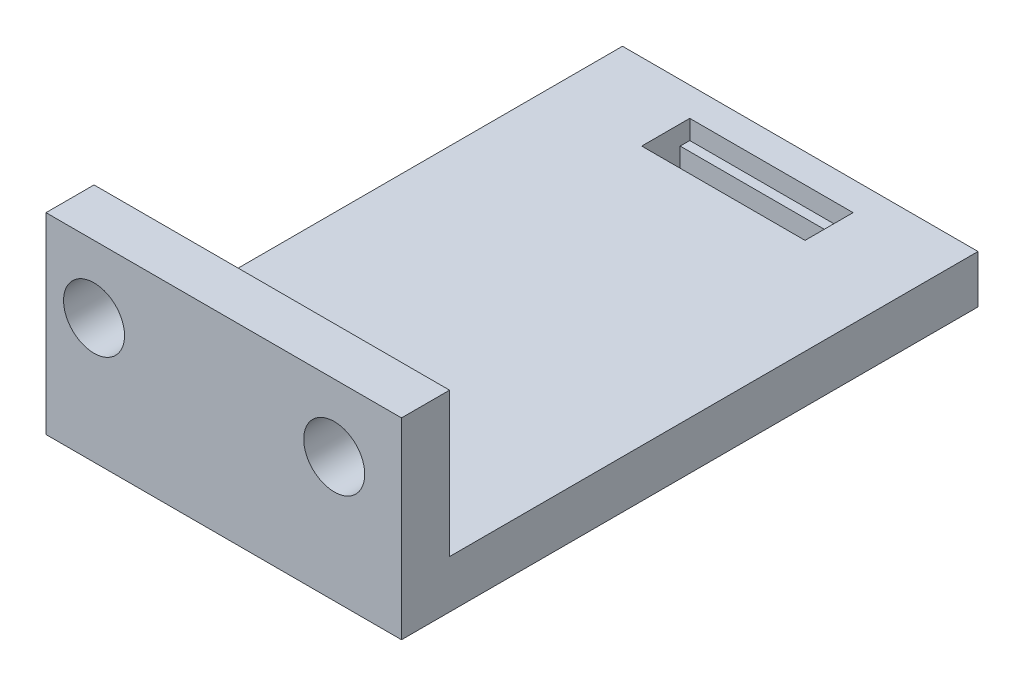
ISO-10303-21;
HEADER;
FILE_DESCRIPTION(('STEP AP214'),'2;1');
FILE_NAME('part.step','',(''),(''),'','','');
FILE_SCHEMA(('AUTOMOTIVE_DESIGN { 1 0 10303 214 1 1 1 1 }'));
ENDSEC;
DATA;
#1=APPLICATION_CONTEXT('core data for automotive mechanical design processes');
#2=APPLICATION_PROTOCOL_DEFINITION('international standard','automotive_design',2000,#1);
#3=PRODUCT_CONTEXT('',#1,'mechanical');
#4=PRODUCT('Part','Part','',(#3));
#5=PRODUCT_RELATED_PRODUCT_CATEGORY('part','',(#4));
#6=PRODUCT_DEFINITION_FORMATION('','',#4);
#7=PRODUCT_DEFINITION_CONTEXT('part definition',#1,'design');
#8=PRODUCT_DEFINITION('design','',#6,#7);
#9=PRODUCT_DEFINITION_SHAPE('','',#8);
#10=(LENGTH_UNIT() NAMED_UNIT(*) SI_UNIT(.MILLI.,.METRE.));
#11=(NAMED_UNIT(*) PLANE_ANGLE_UNIT() SI_UNIT($,.RADIAN.));
#12=(NAMED_UNIT(*) SI_UNIT($,.STERADIAN.) SOLID_ANGLE_UNIT());
#13=UNCERTAINTY_MEASURE_WITH_UNIT(LENGTH_MEASURE(1.E-05),#10,'distance_accuracy_value','');
#14=(GEOMETRIC_REPRESENTATION_CONTEXT(3) GLOBAL_UNCERTAINTY_ASSIGNED_CONTEXT((#13)) GLOBAL_UNIT_ASSIGNED_CONTEXT((#10,
#11,#12)) REPRESENTATION_CONTEXT('',''));
#15=CARTESIAN_POINT('',(0.,0.,0.));
#16=DIRECTION('',(0.,0.,1.));
#17=DIRECTION('',(1.,0.,0.));
#18=AXIS2_PLACEMENT_3D('',#15,#16,#17);
#19=CARTESIAN_POINT('',(0.,3.,0.));
#20=DIRECTION('',(0.,1.,0.));
#21=DIRECTION('',(0.,0.,1.));
#22=AXIS2_PLACEMENT_3D('',#19,#20,#21);
#23=PLANE('',#22);
#24=DIRECTION('',(0.,0.,1.));
#25=VECTOR('',#24,1.);
#26=CARTESIAN_POINT('',(10.,3.,8.));
#27=LINE('',#26,#25);
#28=CARTESIAN_POINT('',(10.,3.,6.99999999999999));
#29=VERTEX_POINT('',#28);
#30=CARTESIAN_POINT('',(10.,3.,8.));
#31=VERTEX_POINT('',#30);
#32=EDGE_CURVE('E180',#29,#31,#27,.T.);
#33=ORIENTED_EDGE('',*,*,#32,.T.);
#34=DIRECTION('',(1.,0.,0.));
#35=VECTOR('',#34,1.);
#36=CARTESIAN_POINT('',(27.,3.,8.));
#37=LINE('',#36,#35);
#38=CARTESIAN_POINT('',(27.,3.,8.));
#39=VERTEX_POINT('',#38);
#40=EDGE_CURVE('E160',#31,#39,#37,.T.);
#41=ORIENTED_EDGE('',*,*,#40,.T.);
#42=DIRECTION('',(0.,0.,-1.));
#43=VECTOR('',#42,1.);
#44=CARTESIAN_POINT('',(27.,3.,3.00000000000001));
#45=LINE('',#44,#43);
#46=CARTESIAN_POINT('',(27.,3.,6.99999999999999));
#47=VERTEX_POINT('',#46);
#48=EDGE_CURVE('E183',#39,#47,#45,.T.);
#49=ORIENTED_EDGE('',*,*,#48,.T.);
#50=DIRECTION('',(1.,0.,0.));
#51=VECTOR('',#50,1.);
#52=CARTESIAN_POINT('',(10.,3.,6.99999999999999));
#53=LINE('',#52,#51);
#54=EDGE_CURVE('E256',#29,#47,#53,.T.);
#55=ORIENTED_EDGE('',*,*,#54,.F.);
#56=EDGE_LOOP('',(#33,#41,#49,#55));
#57=FACE_BOUND('',#56,.T.);
#58=ADVANCED_FACE('F39',(#57),#23,.T.);
#59=CARTESIAN_POINT('',(10.,3.,3.));
#60=VERTEX_POINT('',#59);
#61=CARTESIAN_POINT('',(10.,3.,3.99999999999999));
#62=VERTEX_POINT('',#61);
#63=EDGE_CURVE('E177',#60,#62,#27,.T.);
#64=ORIENTED_EDGE('',*,*,#63,.T.);
#65=DIRECTION('',(-1.,0.,0.));
#66=VECTOR('',#65,1.);
#67=CARTESIAN_POINT('',(10.,3.,3.99999999999999));
#68=LINE('',#67,#66);
#69=CARTESIAN_POINT('',(27.,3.,3.99999999999999));
#70=VERTEX_POINT('',#69);
#71=EDGE_CURVE('E260',#70,#62,#68,.T.);
#72=ORIENTED_EDGE('',*,*,#71,.F.);
#73=CARTESIAN_POINT('',(27.,3.,3.00000000000001));
#74=VERTEX_POINT('',#73);
#75=EDGE_CURVE('E63',#70,#74,#45,.T.);
#76=ORIENTED_EDGE('',*,*,#75,.T.);
#77=DIRECTION('',(-1.,0.,0.));
#78=VECTOR('',#77,1.);
#79=CARTESIAN_POINT('',(10.,3.,3.));
#80=LINE('',#79,#78);
#81=EDGE_CURVE('E154',#74,#60,#80,.T.);
#82=ORIENTED_EDGE('',*,*,#81,.T.);
#83=EDGE_LOOP('',(#64,#72,#76,#82));
#84=FACE_BOUND('',#83,.T.);
#85=ADVANCED_FACE('F347',(#84),#23,.T.);
#86=CARTESIAN_POINT('',(0.,0.,0.));
#87=DIRECTION('',(0.,1.,0.));
#88=DIRECTION('',(0.,0.,1.));
#89=AXIS2_PLACEMENT_3D('',#86,#87,#88);
#90=PLANE('',#89);
#91=DIRECTION('',(0.,0.,1.));
#92=VECTOR('',#91,1.);
#93=CARTESIAN_POINT('',(0.,0.,0.));
#94=LINE('',#93,#92);
#95=CARTESIAN_POINT('',(0.,0.,0.));
#96=VERTEX_POINT('',#95);
#97=CARTESIAN_POINT('',(0.,0.,60.));
#98=VERTEX_POINT('',#97);
#99=EDGE_CURVE('E293',#96,#98,#94,.T.);
#100=ORIENTED_EDGE('',*,*,#99,.F.);
#101=DIRECTION('',(-1.,0.,0.));
#102=VECTOR('',#101,1.);
#103=CARTESIAN_POINT('',(0.,0.,0.));
#104=LINE('',#103,#102);
#105=CARTESIAN_POINT('',(37.,0.,0.));
#106=VERTEX_POINT('',#105);
#107=EDGE_CURVE('E299',#106,#96,#104,.T.);
#108=ORIENTED_EDGE('',*,*,#107,.F.);
#109=DIRECTION('',(0.,0.,-1.));
#110=VECTOR('',#109,1.);
#111=CARTESIAN_POINT('',(37.,0.,0.));
#112=LINE('',#111,#110);
#113=CARTESIAN_POINT('',(37.,0.,60.));
#114=VERTEX_POINT('',#113);
#115=EDGE_CURVE('E296',#114,#106,#112,.T.);
#116=ORIENTED_EDGE('',*,*,#115,.F.);
#117=DIRECTION('',(1.,0.,0.));
#118=VECTOR('',#117,1.);
#119=CARTESIAN_POINT('',(0.,0.,60.));
#120=LINE('',#119,#118);
#121=EDGE_CURVE('E228',#98,#114,#120,.T.);
#122=ORIENTED_EDGE('',*,*,#121,.F.);
#123=EDGE_LOOP('',(#100,#108,#116,#122));
#124=FACE_BOUND('',#123,.T.);
#125=DIRECTION('',(0.,0.,1.));
#126=VECTOR('',#125,1.);
#127=CARTESIAN_POINT('',(10.,0.,3.99999999999999));
#128=LINE('',#127,#126);
#129=CARTESIAN_POINT('',(10.,0.,3.99999999999999));
#130=VERTEX_POINT('',#129);
#131=CARTESIAN_POINT('',(10.,0.,6.99999999999999));
#132=VERTEX_POINT('',#131);
#133=EDGE_CURVE('E255',#130,#132,#128,.T.);
#134=ORIENTED_EDGE('',*,*,#133,.T.);
#135=DIRECTION('',(1.,0.,0.));
#136=VECTOR('',#135,1.);
#137=CARTESIAN_POINT('',(10.,0.,6.99999999999999));
#138=LINE('',#137,#136);
#139=CARTESIAN_POINT('',(27.,0.,6.99999999999999));
#140=VERTEX_POINT('',#139);
#141=EDGE_CURVE('E269',#132,#140,#138,.T.);
#142=ORIENTED_EDGE('',*,*,#141,.T.);
#143=DIRECTION('',(0.,0.,-1.));
#144=VECTOR('',#143,1.);
#145=CARTESIAN_POINT('',(27.,0.,3.99999999999999));
#146=LINE('',#145,#144);
#147=CARTESIAN_POINT('',(27.,0.,3.99999999999999));
#148=VERTEX_POINT('',#147);
#149=EDGE_CURVE('E273',#140,#148,#146,.T.);
#150=ORIENTED_EDGE('',*,*,#149,.T.);
#151=DIRECTION('',(-1.,0.,0.));
#152=VECTOR('',#151,1.);
#153=CARTESIAN_POINT('',(10.,0.,3.99999999999999));
#154=LINE('',#153,#152);
#155=EDGE_CURVE('E261',#148,#130,#154,.T.);
#156=ORIENTED_EDGE('',*,*,#155,.T.);
#157=EDGE_LOOP('',(#134,#142,#150,#156));
#158=FACE_BOUND('',#157,.T.);
#159=ADVANCED_FACE('F312',(#124,#158),#90,.F.);
#160=CARTESIAN_POINT('',(0.,3.,0.));
#161=DIRECTION('',(1.,0.,0.));
#162=DIRECTION('',(0.,0.,-1.));
#163=AXIS2_PLACEMENT_3D('',#160,#161,#162);
#164=PLANE('',#163);
#165=ORIENTED_EDGE('',*,*,#99,.T.);
#166=DIRECTION('',(0.,-1.,0.));
#167=VECTOR('',#166,1.);
#168=CARTESIAN_POINT('',(0.,0.,60.));
#169=LINE('',#168,#167);
#170=CARTESIAN_POINT('',(0.,20.,60.));
#171=VERTEX_POINT('',#170);
#172=EDGE_CURVE('E224',#171,#98,#169,.T.);
#173=ORIENTED_EDGE('',*,*,#172,.F.);
#174=DIRECTION('',(0.,0.,-1.));
#175=VECTOR('',#174,1.);
#176=CARTESIAN_POINT('',(0.,20.,60.));
#177=LINE('',#176,#175);
#178=CARTESIAN_POINT('',(0.,20.,55.));
#179=VERTEX_POINT('',#178);
#180=EDGE_CURVE('E239',#171,#179,#177,.T.);
#181=ORIENTED_EDGE('',*,*,#180,.T.);
#182=DIRECTION('',(0.,-1.,0.));
#183=VECTOR('',#182,1.);
#184=CARTESIAN_POINT('',(0.,0.,55.));
#185=LINE('',#184,#183);
#186=CARTESIAN_POINT('',(0.,5.,55.));
#187=VERTEX_POINT('',#186);
#188=EDGE_CURVE('E220',#179,#187,#185,.T.);
#189=ORIENTED_EDGE('',*,*,#188,.T.);
#190=DIRECTION('',(0.,0.,1.));
#191=VECTOR('',#190,1.);
#192=CARTESIAN_POINT('',(0.,5.,0.));
#193=LINE('',#192,#191);
#194=CARTESIAN_POINT('',(0.,5.,0.));
#195=VERTEX_POINT('',#194);
#196=EDGE_CURVE('E162',#195,#187,#193,.T.);
#197=ORIENTED_EDGE('',*,*,#196,.F.);
#198=DIRECTION('',(0.,-1.,0.));
#199=VECTOR('',#198,1.);
#200=CARTESIAN_POINT('',(0.,3.,0.));
#201=LINE('',#200,#199);
#202=EDGE_CURVE('E48',#195,#96,#201,.T.);
#203=ORIENTED_EDGE('',*,*,#202,.T.);
#204=EDGE_LOOP('',(#165,#173,#181,#189,#197,#203));
#205=FACE_BOUND('',#204,.T.);
#206=ADVANCED_FACE('F41',(#205),#164,.F.);
#207=CARTESIAN_POINT('',(37.,3.,0.));
#208=DIRECTION('',(-1.,0.,0.));
#209=DIRECTION('',(0.,0.,1.));
#210=AXIS2_PLACEMENT_3D('',#207,#208,#209);
#211=PLANE('',#210);
#212=DIRECTION('',(0.,-1.,0.));
#213=VECTOR('',#212,1.);
#214=CARTESIAN_POINT('',(37.,3.,0.));
#215=LINE('',#214,#213);
#216=CARTESIAN_POINT('',(37.,5.,0.));
#217=VERTEX_POINT('',#216);
#218=EDGE_CURVE('E11',#217,#106,#215,.T.);
#219=ORIENTED_EDGE('',*,*,#218,.F.);
#220=DIRECTION('',(0.,0.,-1.));
#221=VECTOR('',#220,1.);
#222=CARTESIAN_POINT('',(37.,5.,0.));
#223=LINE('',#222,#221);
#224=CARTESIAN_POINT('',(37.,5.,55.));
#225=VERTEX_POINT('',#224);
#226=EDGE_CURVE('E55',#225,#217,#223,.T.);
#227=ORIENTED_EDGE('',*,*,#226,.F.);
#228=DIRECTION('',(0.,1.,0.));
#229=VECTOR('',#228,1.);
#230=CARTESIAN_POINT('',(37.,0.,55.));
#231=LINE('',#230,#229);
#232=CARTESIAN_POINT('',(37.,20.,55.));
#233=VERTEX_POINT('',#232);
#234=EDGE_CURVE('E243',#225,#233,#231,.T.);
#235=ORIENTED_EDGE('',*,*,#234,.T.);
#236=DIRECTION('',(0.,0.,-1.));
#237=VECTOR('',#236,1.);
#238=CARTESIAN_POINT('',(37.,20.,60.));
#239=LINE('',#238,#237);
#240=CARTESIAN_POINT('',(37.,20.,60.));
#241=VERTEX_POINT('',#240);
#242=EDGE_CURVE('E251',#241,#233,#239,.T.);
#243=ORIENTED_EDGE('',*,*,#242,.F.);
#244=DIRECTION('',(0.,1.,0.));
#245=VECTOR('',#244,1.);
#246=CARTESIAN_POINT('',(37.,0.,60.));
#247=LINE('',#246,#245);
#248=EDGE_CURVE('E233',#114,#241,#247,.T.);
#249=ORIENTED_EDGE('',*,*,#248,.F.);
#250=ORIENTED_EDGE('',*,*,#115,.T.);
#251=EDGE_LOOP('',(#219,#227,#235,#243,#249,#250));
#252=FACE_BOUND('',#251,.T.);
#253=ADVANCED_FACE('F330',(#252),#211,.F.);
#254=CARTESIAN_POINT('',(0.,3.,0.));
#255=DIRECTION('',(0.,0.,1.));
#256=DIRECTION('',(1.,0.,0.));
#257=AXIS2_PLACEMENT_3D('',#254,#255,#256);
#258=PLANE('',#257);
#259=ORIENTED_EDGE('',*,*,#107,.T.);
#260=ORIENTED_EDGE('',*,*,#202,.F.);
#261=DIRECTION('',(-1.,0.,0.));
#262=VECTOR('',#261,1.);
#263=CARTESIAN_POINT('',(0.,5.,0.));
#264=LINE('',#263,#262);
#265=EDGE_CURVE('E203',#217,#195,#264,.T.);
#266=ORIENTED_EDGE('',*,*,#265,.F.);
#267=ORIENTED_EDGE('',*,*,#218,.T.);
#268=EDGE_LOOP('',(#259,#260,#266,#267));
#269=FACE_BOUND('',#268,.T.);
#270=ADVANCED_FACE('F329',(#269),#258,.F.);
#271=CARTESIAN_POINT('',(10.,3.,3.99999999999999));
#272=DIRECTION('',(1.,0.,0.));
#273=DIRECTION('',(0.,0.,-1.));
#274=AXIS2_PLACEMENT_3D('',#271,#272,#273);
#275=PLANE('',#274);
#276=ORIENTED_EDGE('',*,*,#133,.F.);
#277=DIRECTION('',(0.,-1.,0.));
#278=VECTOR('',#277,1.);
#279=CARTESIAN_POINT('',(10.,3.,3.99999999999999));
#280=LINE('',#279,#278);
#281=EDGE_CURVE('E265',#62,#130,#280,.T.);
#282=ORIENTED_EDGE('',*,*,#281,.F.);
#283=ORIENTED_EDGE('',*,*,#63,.F.);
#284=DIRECTION('',(0.,-1.,0.));
#285=VECTOR('',#284,1.);
#286=CARTESIAN_POINT('',(10.,5.,3.));
#287=LINE('',#286,#285);
#288=CARTESIAN_POINT('',(10.,5.,3.));
#289=VERTEX_POINT('',#288);
#290=EDGE_CURVE('E148',#289,#60,#287,.T.);
#291=ORIENTED_EDGE('',*,*,#290,.F.);
#292=DIRECTION('',(0.,0.,1.));
#293=VECTOR('',#292,1.);
#294=CARTESIAN_POINT('',(10.,5.,8.));
#295=LINE('',#294,#293);
#296=CARTESIAN_POINT('',(10.,5.,8.));
#297=VERTEX_POINT('',#296);
#298=EDGE_CURVE('E142',#289,#297,#295,.T.);
#299=ORIENTED_EDGE('',*,*,#298,.T.);
#300=DIRECTION('',(0.,-1.,0.));
#301=VECTOR('',#300,1.);
#302=CARTESIAN_POINT('',(10.,5.,8.));
#303=LINE('',#302,#301);
#304=EDGE_CURVE('E145',#297,#31,#303,.T.);
#305=ORIENTED_EDGE('',*,*,#304,.T.);
#306=ORIENTED_EDGE('',*,*,#32,.F.);
#307=DIRECTION('',(0.,-1.,0.));
#308=VECTOR('',#307,1.);
#309=CARTESIAN_POINT('',(10.,3.,6.99999999999999));
#310=LINE('',#309,#308);
#311=EDGE_CURVE('E289',#29,#132,#310,.T.);
#312=ORIENTED_EDGE('',*,*,#311,.T.);
#313=EDGE_LOOP('',(#276,#282,#283,#291,#299,#305,#306,#312));
#314=FACE_BOUND('',#313,.T.);
#315=ADVANCED_FACE('F144',(#314),#275,.T.);
#316=CARTESIAN_POINT('',(10.,3.,6.99999999999999));
#317=DIRECTION('',(0.,0.,-1.));
#318=DIRECTION('',(-1.,0.,0.));
#319=AXIS2_PLACEMENT_3D('',#316,#317,#318);
#320=PLANE('',#319);
#321=ORIENTED_EDGE('',*,*,#141,.F.);
#322=ORIENTED_EDGE('',*,*,#311,.F.);
#323=ORIENTED_EDGE('',*,*,#54,.T.);
#324=DIRECTION('',(0.,-1.,0.));
#325=VECTOR('',#324,1.);
#326=CARTESIAN_POINT('',(27.,3.,6.99999999999999));
#327=LINE('',#326,#325);
#328=EDGE_CURVE('E286',#47,#140,#327,.T.);
#329=ORIENTED_EDGE('',*,*,#328,.T.);
#330=EDGE_LOOP('',(#321,#322,#323,#329));
#331=FACE_BOUND('',#330,.T.);
#332=ADVANCED_FACE('F427',(#331),#320,.T.);
#333=CARTESIAN_POINT('',(27.,3.,3.99999999999999));
#334=DIRECTION('',(-1.,0.,0.));
#335=DIRECTION('',(0.,0.,1.));
#336=AXIS2_PLACEMENT_3D('',#333,#334,#335);
#337=PLANE('',#336);
#338=ORIENTED_EDGE('',*,*,#149,.F.);
#339=ORIENTED_EDGE('',*,*,#328,.F.);
#340=ORIENTED_EDGE('',*,*,#48,.F.);
#341=DIRECTION('',(0.,-1.,0.));
#342=VECTOR('',#341,1.);
#343=CARTESIAN_POINT('',(27.,5.,8.));
#344=LINE('',#343,#342);
#345=CARTESIAN_POINT('',(27.,5.,8.));
#346=VERTEX_POINT('',#345);
#347=EDGE_CURVE('E163',#346,#39,#344,.T.);
#348=ORIENTED_EDGE('',*,*,#347,.F.);
#349=DIRECTION('',(0.,0.,-1.));
#350=VECTOR('',#349,1.);
#351=CARTESIAN_POINT('',(27.,5.,3.00000000000001));
#352=LINE('',#351,#350);
#353=CARTESIAN_POINT('',(27.,5.,3.00000000000001));
#354=VERTEX_POINT('',#353);
#355=EDGE_CURVE('E168',#346,#354,#352,.T.);
#356=ORIENTED_EDGE('',*,*,#355,.T.);
#357=DIRECTION('',(0.,-1.,0.));
#358=VECTOR('',#357,1.);
#359=CARTESIAN_POINT('',(27.,5.,3.00000000000001));
#360=LINE('',#359,#358);
#361=EDGE_CURVE('E191',#354,#74,#360,.T.);
#362=ORIENTED_EDGE('',*,*,#361,.T.);
#363=ORIENTED_EDGE('',*,*,#75,.F.);
#364=DIRECTION('',(0.,-1.,0.));
#365=VECTOR('',#364,1.);
#366=CARTESIAN_POINT('',(27.,3.,3.99999999999999));
#367=LINE('',#366,#365);
#368=EDGE_CURVE('E283',#70,#148,#367,.T.);
#369=ORIENTED_EDGE('',*,*,#368,.T.);
#370=EDGE_LOOP('',(#338,#339,#340,#348,#356,#362,#363,#369));
#371=FACE_BOUND('',#370,.T.);
#372=ADVANCED_FACE('F420',(#371),#337,.T.);
#373=CARTESIAN_POINT('',(10.,3.,3.99999999999999));
#374=DIRECTION('',(0.,0.,1.));
#375=DIRECTION('',(1.,0.,0.));
#376=AXIS2_PLACEMENT_3D('',#373,#374,#375);
#377=PLANE('',#376);
#378=ORIENTED_EDGE('',*,*,#155,.F.);
#379=ORIENTED_EDGE('',*,*,#368,.F.);
#380=ORIENTED_EDGE('',*,*,#71,.T.);
#381=ORIENTED_EDGE('',*,*,#281,.T.);
#382=EDGE_LOOP('',(#378,#379,#380,#381));
#383=FACE_BOUND('',#382,.T.);
#384=ADVANCED_FACE('F414',(#383),#377,.T.);
#385=CARTESIAN_POINT('',(0.,0.,55.));
#386=DIRECTION('',(0.,0.,-1.));
#387=DIRECTION('',(-1.,0.,0.));
#388=AXIS2_PLACEMENT_3D('',#385,#386,#387);
#389=PLANE('',#388);
#390=DIRECTION('',(1.,0.,0.));
#391=VECTOR('',#390,1.);
#392=CARTESIAN_POINT('',(0.,5.,55.));
#393=LINE('',#392,#391);
#394=EDGE_CURVE('E198',#187,#225,#393,.T.);
#395=ORIENTED_EDGE('',*,*,#394,.F.);
#396=ORIENTED_EDGE('',*,*,#188,.F.);
#397=DIRECTION('',(-1.,0.,0.));
#398=VECTOR('',#397,1.);
#399=CARTESIAN_POINT('',(0.,20.,55.));
#400=LINE('',#399,#398);
#401=EDGE_CURVE('E229',#233,#179,#400,.T.);
#402=ORIENTED_EDGE('',*,*,#401,.F.);
#403=ORIENTED_EDGE('',*,*,#234,.F.);
#404=EDGE_LOOP('',(#395,#396,#402,#403));
#405=FACE_BOUND('',#404,.T.);
#406=CARTESIAN_POINT('',(30.,13.,55.));
#407=DIRECTION('',(0.,0.,1.));
#408=DIRECTION('',(1.,0.,0.));
#409=AXIS2_PLACEMENT_3D('',#406,#407,#408);
#410=CIRCLE('',#409,3.175);
#411=CARTESIAN_POINT('',(33.175,13.,55.));
#412=VERTEX_POINT('',#411);
#413=EDGE_CURVE('E207',#412,#412,#410,.T.);
#414=ORIENTED_EDGE('',*,*,#413,.T.);
#415=EDGE_LOOP('',(#414));
#416=FACE_BOUND('',#415,.T.);
#417=CARTESIAN_POINT('',(4.99999999999999,13.,55.));
#418=DIRECTION('',(0.,0.,1.));
#419=DIRECTION('',(1.,0.,0.));
#420=AXIS2_PLACEMENT_3D('',#417,#418,#419);
#421=CIRCLE('',#420,3.175);
#422=CARTESIAN_POINT('',(8.17499999999999,13.,55.));
#423=VERTEX_POINT('',#422);
#424=EDGE_CURVE('E212',#423,#423,#421,.T.);
#425=ORIENTED_EDGE('',*,*,#424,.T.);
#426=EDGE_LOOP('',(#425));
#427=FACE_BOUND('',#426,.T.);
#428=ADVANCED_FACE('F325',(#405,#416,#427),#389,.T.);
#429=CARTESIAN_POINT('',(0.,0.,60.));
#430=DIRECTION('',(0.,0.,-1.));
#431=DIRECTION('',(-1.,0.,0.));
#432=AXIS2_PLACEMENT_3D('',#429,#430,#431);
#433=PLANE('',#432);
#434=ORIENTED_EDGE('',*,*,#172,.T.);
#435=ORIENTED_EDGE('',*,*,#121,.T.);
#436=ORIENTED_EDGE('',*,*,#248,.T.);
#437=DIRECTION('',(-1.,0.,0.));
#438=VECTOR('',#437,1.);
#439=CARTESIAN_POINT('',(0.,20.,60.));
#440=LINE('',#439,#438);
#441=EDGE_CURVE('E236',#241,#171,#440,.T.);
#442=ORIENTED_EDGE('',*,*,#441,.T.);
#443=EDGE_LOOP('',(#434,#435,#436,#442));
#444=FACE_BOUND('',#443,.T.);
#445=CARTESIAN_POINT('',(4.99999999999999,13.,60.));
#446=DIRECTION('',(0.,0.,1.));
#447=DIRECTION('',(1.,0.,0.));
#448=AXIS2_PLACEMENT_3D('',#445,#446,#447);
#449=CIRCLE('',#448,3.175);
#450=CARTESIAN_POINT('',(8.17499999999999,13.,60.));
#451=VERTEX_POINT('',#450);
#452=EDGE_CURVE('E216',#451,#451,#449,.T.);
#453=ORIENTED_EDGE('',*,*,#452,.F.);
#454=EDGE_LOOP('',(#453));
#455=FACE_BOUND('',#454,.T.);
#456=CARTESIAN_POINT('',(30.,13.,60.));
#457=DIRECTION('',(0.,0.,1.));
#458=DIRECTION('',(1.,0.,0.));
#459=AXIS2_PLACEMENT_3D('',#456,#457,#458);
#460=CIRCLE('',#459,3.175);
#461=CARTESIAN_POINT('',(33.175,13.,60.));
#462=VERTEX_POINT('',#461);
#463=EDGE_CURVE('E208',#462,#462,#460,.T.);
#464=ORIENTED_EDGE('',*,*,#463,.F.);
#465=EDGE_LOOP('',(#464));
#466=FACE_BOUND('',#465,.T.);
#467=ADVANCED_FACE('F316',(#444,#455,#466),#433,.F.);
#468=CARTESIAN_POINT('',(0.,20.,60.));
#469=DIRECTION('',(0.,-1.,0.));
#470=DIRECTION('',(0.,0.,-1.));
#471=AXIS2_PLACEMENT_3D('',#468,#469,#470);
#472=PLANE('',#471);
#473=ORIENTED_EDGE('',*,*,#401,.T.);
#474=ORIENTED_EDGE('',*,*,#180,.F.);
#475=ORIENTED_EDGE('',*,*,#441,.F.);
#476=ORIENTED_EDGE('',*,*,#242,.T.);
#477=EDGE_LOOP('',(#473,#474,#475,#476));
#478=FACE_BOUND('',#477,.T.);
#479=ADVANCED_FACE('F332',(#478),#472,.F.);
#480=CARTESIAN_POINT('',(4.99999999999999,13.,60.));
#481=DIRECTION('',(0.,0.,-1.));
#482=DIRECTION('',(-1.,0.,0.));
#483=AXIS2_PLACEMENT_3D('',#480,#481,#482);
#484=CYLINDRICAL_SURFACE('',#483,3.175);
#485=ORIENTED_EDGE('',*,*,#452,.T.);
#486=EDGE_LOOP('',(#485));
#487=FACE_BOUND('',#486,.T.);
#488=ORIENTED_EDGE('',*,*,#424,.F.);
#489=EDGE_LOOP('',(#488));
#490=FACE_BOUND('',#489,.T.);
#491=ADVANCED_FACE('F334',(#487,#490),#484,.F.);
#492=CARTESIAN_POINT('',(30.,13.,60.));
#493=DIRECTION('',(0.,0.,-1.));
#494=DIRECTION('',(-1.,0.,0.));
#495=AXIS2_PLACEMENT_3D('',#492,#493,#494);
#496=CYLINDRICAL_SURFACE('',#495,3.175);
#497=ORIENTED_EDGE('',*,*,#463,.T.);
#498=EDGE_LOOP('',(#497));
#499=FACE_BOUND('',#498,.T.);
#500=ORIENTED_EDGE('',*,*,#413,.F.);
#501=EDGE_LOOP('',(#500));
#502=FACE_BOUND('',#501,.T.);
#503=ADVANCED_FACE('F340',(#499,#502),#496,.F.);
#504=CARTESIAN_POINT('',(0.,5.,0.));
#505=DIRECTION('',(0.,1.,0.));
#506=DIRECTION('',(0.,0.,1.));
#507=AXIS2_PLACEMENT_3D('',#504,#505,#506);
#508=PLANE('',#507);
#509=ORIENTED_EDGE('',*,*,#196,.T.);
#510=ORIENTED_EDGE('',*,*,#394,.T.);
#511=ORIENTED_EDGE('',*,*,#226,.T.);
#512=ORIENTED_EDGE('',*,*,#265,.T.);
#513=EDGE_LOOP('',(#509,#510,#511,#512));
#514=FACE_BOUND('',#513,.T.);
#515=DIRECTION('',(1.,0.,0.));
#516=VECTOR('',#515,1.);
#517=CARTESIAN_POINT('',(27.,5.,8.));
#518=LINE('',#517,#516);
#519=EDGE_CURVE('E153',#297,#346,#518,.T.);
#520=ORIENTED_EDGE('',*,*,#519,.F.);
#521=ORIENTED_EDGE('',*,*,#298,.F.);
#522=DIRECTION('',(-1.,0.,0.));
#523=VECTOR('',#522,1.);
#524=CARTESIAN_POINT('',(10.,5.,3.));
#525=LINE('',#524,#523);
#526=EDGE_CURVE('E172',#354,#289,#525,.T.);
#527=ORIENTED_EDGE('',*,*,#526,.F.);
#528=ORIENTED_EDGE('',*,*,#355,.F.);
#529=EDGE_LOOP('',(#520,#521,#527,#528));
#530=FACE_BOUND('',#529,.T.);
#531=ADVANCED_FACE('F166',(#514,#530),#508,.T.);
#532=CARTESIAN_POINT('',(27.,5.,8.));
#533=DIRECTION('',(0.,0.,-1.));
#534=DIRECTION('',(-1.,0.,0.));
#535=AXIS2_PLACEMENT_3D('',#532,#533,#534);
#536=PLANE('',#535);
#537=ORIENTED_EDGE('',*,*,#40,.F.);
#538=ORIENTED_EDGE('',*,*,#304,.F.);
#539=ORIENTED_EDGE('',*,*,#519,.T.);
#540=ORIENTED_EDGE('',*,*,#347,.T.);
#541=EDGE_LOOP('',(#537,#538,#539,#540));
#542=FACE_BOUND('',#541,.T.);
#543=ADVANCED_FACE('F157',(#542),#536,.T.);
#544=CARTESIAN_POINT('',(10.,5.,3.));
#545=DIRECTION('',(0.,0.,1.));
#546=DIRECTION('',(1.,0.,0.));
#547=AXIS2_PLACEMENT_3D('',#544,#545,#546);
#548=PLANE('',#547);
#549=ORIENTED_EDGE('',*,*,#81,.F.);
#550=ORIENTED_EDGE('',*,*,#361,.F.);
#551=ORIENTED_EDGE('',*,*,#526,.T.);
#552=ORIENTED_EDGE('',*,*,#290,.T.);
#553=EDGE_LOOP('',(#549,#550,#551,#552));
#554=FACE_BOUND('',#553,.T.);
#555=ADVANCED_FACE('F497',(#554),#548,.T.);
#556=CLOSED_SHELL('',(#58,#85,#159,#206,#253,#270,#315,#332,#372,#384,#428,#467,#479,#491,#503,
#531,#543,#555));
#557=MANIFOLD_SOLID_BREP('B2',#556);
#558=ADVANCED_BREP_SHAPE_REPRESENTATION('',(#18,#557),#14);
#559=SHAPE_DEFINITION_REPRESENTATION(#9,#558);
ENDSEC;
END-ISO-10303-21;
